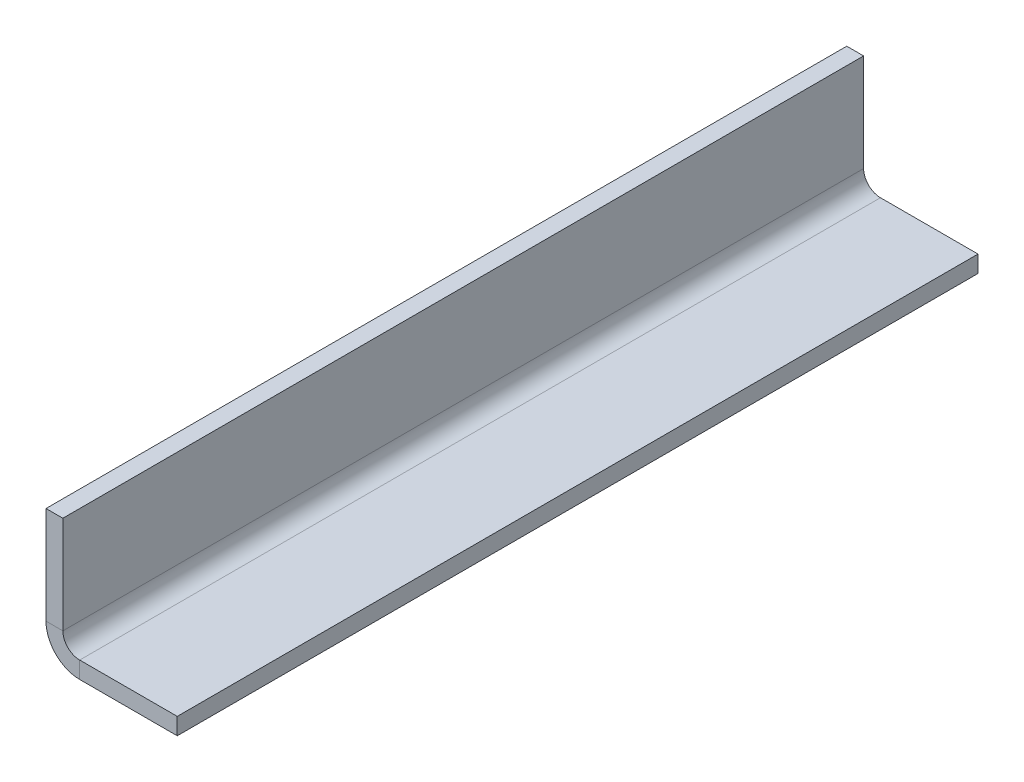
ISO-10303-21;
HEADER;
FILE_DESCRIPTION(('STEP AP214'),'2;1');
FILE_NAME('part.step','',(''),(''),'','','');
FILE_SCHEMA(('AUTOMOTIVE_DESIGN { 1 0 10303 214 1 1 1 1 }'));
ENDSEC;
DATA;
#1=APPLICATION_CONTEXT('core data for automotive mechanical design processes');
#2=APPLICATION_PROTOCOL_DEFINITION('international standard','automotive_design',2000,#1);
#3=PRODUCT_CONTEXT('',#1,'mechanical');
#4=PRODUCT('Part','Part','',(#3));
#5=PRODUCT_RELATED_PRODUCT_CATEGORY('part','',(#4));
#6=PRODUCT_DEFINITION_FORMATION('','',#4);
#7=PRODUCT_DEFINITION_CONTEXT('part definition',#1,'design');
#8=PRODUCT_DEFINITION('design','',#6,#7);
#9=PRODUCT_DEFINITION_SHAPE('','',#8);
#10=(LENGTH_UNIT() NAMED_UNIT(*) SI_UNIT(.MILLI.,.METRE.));
#11=(NAMED_UNIT(*) PLANE_ANGLE_UNIT() SI_UNIT($,.RADIAN.));
#12=(NAMED_UNIT(*) SI_UNIT($,.STERADIAN.) SOLID_ANGLE_UNIT());
#13=UNCERTAINTY_MEASURE_WITH_UNIT(LENGTH_MEASURE(1.E-05),#10,'distance_accuracy_value','');
#14=(GEOMETRIC_REPRESENTATION_CONTEXT(3) GLOBAL_UNCERTAINTY_ASSIGNED_CONTEXT((#13)) GLOBAL_UNIT_ASSIGNED_CONTEXT((#10,
#11,#12)) REPRESENTATION_CONTEXT('',''));
#15=CARTESIAN_POINT('',(0.,0.,0.));
#16=DIRECTION('',(0.,0.,1.));
#17=DIRECTION('',(1.,0.,0.));
#18=AXIS2_PLACEMENT_3D('',#15,#16,#17);
#19=CARTESIAN_POINT('',(-0.7366,-2.5,-17.5));
#20=DIRECTION('',(0.,0.,-1.));
#21=DIRECTION('',(-1.,0.,0.));
#22=AXIS2_PLACEMENT_3D('',#19,#20,#21);
#23=PLANE('',#22);
#24=DIRECTION('',(0.,1.,0.));
#25=VECTOR('',#24,1.);
#26=CARTESIAN_POINT('',(0.,-2.5,-17.5));
#27=LINE('',#26,#25);
#28=CARTESIAN_POINT('',(0.,-1.7634,-17.5));
#29=VERTEX_POINT('',#28);
#30=CARTESIAN_POINT('',(0.,2.5,-17.5));
#31=VERTEX_POINT('',#30);
#32=EDGE_CURVE('E87',#29,#31,#27,.T.);
#33=ORIENTED_EDGE('',*,*,#32,.F.);
#34=DIRECTION('',(-1.,0.,0.));
#35=VECTOR('',#34,1.);
#36=CARTESIAN_POINT('',(0.,-1.7634,-17.5));
#37=LINE('',#36,#35);
#38=CARTESIAN_POINT('',(-0.736599999999998,-1.7634,-17.5));
#39=VERTEX_POINT('',#38);
#40=EDGE_CURVE('E96',#29,#39,#37,.T.);
#41=ORIENTED_EDGE('',*,*,#40,.T.);
#42=DIRECTION('',(0.,1.,0.));
#43=VECTOR('',#42,1.);
#44=CARTESIAN_POINT('',(-0.7366,-2.5,-17.5));
#45=LINE('',#44,#43);
#46=CARTESIAN_POINT('',(-0.7366,2.5,-17.5));
#47=VERTEX_POINT('',#46);
#48=EDGE_CURVE('E83',#39,#47,#45,.T.);
#49=ORIENTED_EDGE('',*,*,#48,.T.);
#50=DIRECTION('',(1.,0.,0.));
#51=VECTOR('',#50,1.);
#52=CARTESIAN_POINT('',(-0.7366,2.5,-17.5));
#53=LINE('',#52,#51);
#54=EDGE_CURVE('E38',#47,#31,#53,.T.);
#55=ORIENTED_EDGE('',*,*,#54,.T.);
#56=EDGE_LOOP('',(#33,#41,#49,#55));
#57=FACE_BOUND('',#56,.T.);
#58=ADVANCED_FACE('F35',(#57),#23,.T.);
#59=CARTESIAN_POINT('',(-0.7366,0.,0.));
#60=DIRECTION('',(-1.,0.,0.));
#61=DIRECTION('',(0.,0.,1.));
#62=AXIS2_PLACEMENT_3D('',#59,#60,#61);
#63=PLANE('',#62);
#64=ORIENTED_EDGE('',*,*,#48,.F.);
#65=DIRECTION('',(0.,0.,-1.));
#66=VECTOR('',#65,1.);
#67=CARTESIAN_POINT('',(-0.736599999999998,-1.7634,-17.5));
#68=LINE('',#67,#66);
#69=CARTESIAN_POINT('',(-0.7366,-1.7634,17.5));
#70=VERTEX_POINT('',#69);
#71=EDGE_CURVE('E113',#39,#70,#68,.F.);
#72=ORIENTED_EDGE('',*,*,#71,.T.);
#73=DIRECTION('',(0.,-1.,0.));
#74=VECTOR('',#73,1.);
#75=CARTESIAN_POINT('',(-0.7366,-2.5,17.5));
#76=LINE('',#75,#74);
#77=CARTESIAN_POINT('',(-0.7366,2.5,17.5));
#78=VERTEX_POINT('',#77);
#79=EDGE_CURVE('E92',#78,#70,#76,.T.);
#80=ORIENTED_EDGE('',*,*,#79,.F.);
#81=DIRECTION('',(0.,0.,1.));
#82=VECTOR('',#81,1.);
#83=CARTESIAN_POINT('',(-0.7366,2.5,17.5));
#84=LINE('',#83,#82);
#85=EDGE_CURVE('E74',#47,#78,#84,.T.);
#86=ORIENTED_EDGE('',*,*,#85,.F.);
#87=EDGE_LOOP('',(#64,#72,#80,#86));
#88=FACE_BOUND('',#87,.T.);
#89=ADVANCED_FACE('F201',(#88),#63,.T.);
#90=CARTESIAN_POINT('',(0.,0.,0.));
#91=DIRECTION('',(-1.,0.,0.));
#92=DIRECTION('',(0.,0.,1.));
#93=AXIS2_PLACEMENT_3D('',#90,#91,#92);
#94=PLANE('',#93);
#95=DIRECTION('',(0.,0.,-1.));
#96=VECTOR('',#95,1.);
#97=CARTESIAN_POINT('',(0.,-1.7634,-17.5));
#98=LINE('',#97,#96);
#99=CARTESIAN_POINT('',(0.,-1.7634,17.5));
#100=VERTEX_POINT('',#99);
#101=EDGE_CURVE('E103',#29,#100,#98,.F.);
#102=ORIENTED_EDGE('',*,*,#101,.F.);
#103=ORIENTED_EDGE('',*,*,#32,.T.);
#104=DIRECTION('',(0.,0.,1.));
#105=VECTOR('',#104,1.);
#106=CARTESIAN_POINT('',(0.,2.5,17.5));
#107=LINE('',#106,#105);
#108=CARTESIAN_POINT('',(0.,2.5,17.5));
#109=VERTEX_POINT('',#108);
#110=EDGE_CURVE('E72',#31,#109,#107,.T.);
#111=ORIENTED_EDGE('',*,*,#110,.T.);
#112=DIRECTION('',(0.,-1.,0.));
#113=VECTOR('',#112,1.);
#114=CARTESIAN_POINT('',(0.,-2.5,17.5));
#115=LINE('',#114,#113);
#116=EDGE_CURVE('E77',#109,#100,#115,.T.);
#117=ORIENTED_EDGE('',*,*,#116,.T.);
#118=EDGE_LOOP('',(#102,#103,#111,#117));
#119=FACE_BOUND('',#118,.T.);
#120=ADVANCED_FACE('F85',(#119),#94,.F.);
#121=CARTESIAN_POINT('',(-0.7366,-2.5,17.5));
#122=DIRECTION('',(0.,0.,1.));
#123=DIRECTION('',(1.,0.,0.));
#124=AXIS2_PLACEMENT_3D('',#121,#122,#123);
#125=PLANE('',#124);
#126=DIRECTION('',(-1.,0.,0.));
#127=VECTOR('',#126,1.);
#128=CARTESIAN_POINT('',(0.,-1.7634,17.5));
#129=LINE('',#128,#127);
#130=EDGE_CURVE('E80',#100,#70,#129,.T.);
#131=ORIENTED_EDGE('',*,*,#130,.F.);
#132=ORIENTED_EDGE('',*,*,#116,.F.);
#133=DIRECTION('',(1.,0.,0.));
#134=VECTOR('',#133,1.);
#135=CARTESIAN_POINT('',(-0.7366,2.5,17.5));
#136=LINE('',#135,#134);
#137=EDGE_CURVE('E11',#78,#109,#136,.T.);
#138=ORIENTED_EDGE('',*,*,#137,.F.);
#139=ORIENTED_EDGE('',*,*,#79,.T.);
#140=EDGE_LOOP('',(#131,#132,#138,#139));
#141=FACE_BOUND('',#140,.T.);
#142=ADVANCED_FACE('F78',(#141),#125,.T.);
#143=CARTESIAN_POINT('',(-0.7366,2.5,17.5));
#144=DIRECTION('',(0.,1.,0.));
#145=DIRECTION('',(0.,0.,1.));
#146=AXIS2_PLACEMENT_3D('',#143,#144,#145);
#147=PLANE('',#146);
#148=ORIENTED_EDGE('',*,*,#110,.F.);
#149=ORIENTED_EDGE('',*,*,#54,.F.);
#150=ORIENTED_EDGE('',*,*,#85,.T.);
#151=ORIENTED_EDGE('',*,*,#137,.T.);
#152=EDGE_LOOP('',(#148,#149,#150,#151));
#153=FACE_BOUND('',#152,.T.);
#154=ADVANCED_FACE('F69',(#153),#147,.T.);
#155=CARTESIAN_POINT('',(0.736599999999999,-1.7634,17.5));
#156=DIRECTION('',(0.,0.,1.));
#157=DIRECTION('',(1.,0.,0.));
#158=AXIS2_PLACEMENT_3D('',#155,#156,#157);
#159=PLANE('',#158);
#160=DIRECTION('',(0.,-1.,0.));
#161=VECTOR('',#160,1.);
#162=CARTESIAN_POINT('',(0.736599999999997,-2.5,17.5));
#163=LINE('',#162,#161);
#164=CARTESIAN_POINT('',(0.736599999999997,-2.5,17.5));
#165=VERTEX_POINT('',#164);
#166=CARTESIAN_POINT('',(0.736599999999994,-3.2366,17.5));
#167=VERTEX_POINT('',#166);
#168=EDGE_CURVE('E143',#165,#167,#163,.T.);
#169=ORIENTED_EDGE('',*,*,#168,.F.);
#170=CARTESIAN_POINT('',(0.736599999999999,-1.7634,17.5));
#171=DIRECTION('',(0.,0.,-1.));
#172=DIRECTION('',(-1.,0.,0.));
#173=AXIS2_PLACEMENT_3D('',#170,#171,#172);
#174=CIRCLE('',#173,0.7366);
#175=EDGE_CURVE('E107',#100,#165,#174,.F.);
#176=ORIENTED_EDGE('',*,*,#175,.F.);
#177=ORIENTED_EDGE('',*,*,#130,.T.);
#178=CARTESIAN_POINT('',(0.736599999999999,-1.7634,17.5));
#179=DIRECTION('',(0.,0.,-1.));
#180=DIRECTION('',(-1.,0.,0.));
#181=AXIS2_PLACEMENT_3D('',#178,#179,#180);
#182=CIRCLE('',#181,1.4732);
#183=EDGE_CURVE('E49',#70,#167,#182,.F.);
#184=ORIENTED_EDGE('',*,*,#183,.T.);
#185=EDGE_LOOP('',(#169,#176,#177,#184));
#186=FACE_BOUND('',#185,.T.);
#187=ADVANCED_FACE('F198',(#186),#159,.T.);
#188=CARTESIAN_POINT('',(0.736600000000002,-1.7634,-17.5));
#189=DIRECTION('',(0.,0.,1.));
#190=DIRECTION('',(1.,0.,0.));
#191=AXIS2_PLACEMENT_3D('',#188,#189,#190);
#192=PLANE('',#191);
#193=CARTESIAN_POINT('',(0.736600000000002,-1.7634,-17.5));
#194=DIRECTION('',(0.,0.,-1.));
#195=DIRECTION('',(-1.,0.,0.));
#196=AXIS2_PLACEMENT_3D('',#193,#194,#195);
#197=CIRCLE('',#196,0.7366);
#198=CARTESIAN_POINT('',(0.736599999999999,-2.5,-17.5));
#199=VERTEX_POINT('',#198);
#200=EDGE_CURVE('E100',#199,#29,#197,.T.);
#201=ORIENTED_EDGE('',*,*,#200,.F.);
#202=DIRECTION('',(0.,-1.,0.));
#203=VECTOR('',#202,1.);
#204=CARTESIAN_POINT('',(0.736599999999999,-2.5,-17.5));
#205=LINE('',#204,#203);
#206=CARTESIAN_POINT('',(0.736599999999996,-3.2366,-17.5));
#207=VERTEX_POINT('',#206);
#208=EDGE_CURVE('E142',#199,#207,#205,.T.);
#209=ORIENTED_EDGE('',*,*,#208,.T.);
#210=CARTESIAN_POINT('',(0.736600000000002,-1.7634,-17.5));
#211=DIRECTION('',(0.,0.,-1.));
#212=DIRECTION('',(-1.,0.,0.));
#213=AXIS2_PLACEMENT_3D('',#210,#211,#212);
#214=CIRCLE('',#213,1.4732);
#215=EDGE_CURVE('E110',#207,#39,#214,.T.);
#216=ORIENTED_EDGE('',*,*,#215,.T.);
#217=ORIENTED_EDGE('',*,*,#40,.F.);
#218=EDGE_LOOP('',(#201,#209,#216,#217));
#219=FACE_BOUND('',#218,.T.);
#220=ADVANCED_FACE('F164',(#219),#192,.F.);
#221=CARTESIAN_POINT('',(0.736600000000002,-1.7634,-17.5));
#222=DIRECTION('',(0.,0.,-1.));
#223=DIRECTION('',(0.,-1.,0.));
#224=AXIS2_PLACEMENT_3D('',#221,#222,#223);
#225=CYLINDRICAL_SURFACE('',#224,1.4732);
#226=ORIENTED_EDGE('',*,*,#71,.F.);
#227=ORIENTED_EDGE('',*,*,#215,.F.);
#228=DIRECTION('',(0.,0.,1.));
#229=VECTOR('',#228,1.);
#230=CARTESIAN_POINT('',(0.736599999999995,-3.2366,0.));
#231=LINE('',#230,#229);
#232=EDGE_CURVE('E133',#207,#167,#231,.T.);
#233=ORIENTED_EDGE('',*,*,#232,.T.);
#234=ORIENTED_EDGE('',*,*,#183,.F.);
#235=EDGE_LOOP('',(#226,#227,#233,#234));
#236=FACE_BOUND('',#235,.T.);
#237=ADVANCED_FACE('F202',(#236),#225,.T.);
#238=CARTESIAN_POINT('',(0.736600000000002,-1.7634,-17.5));
#239=DIRECTION('',(0.,0.,-1.));
#240=DIRECTION('',(0.,-1.,0.));
#241=AXIS2_PLACEMENT_3D('',#238,#239,#240);
#242=CYLINDRICAL_SURFACE('',#241,0.7366);
#243=ORIENTED_EDGE('',*,*,#101,.T.);
#244=ORIENTED_EDGE('',*,*,#175,.T.);
#245=DIRECTION('',(0.,0.,-1.));
#246=VECTOR('',#245,1.);
#247=CARTESIAN_POINT('',(0.736599999999997,-2.5,17.5));
#248=LINE('',#247,#246);
#249=EDGE_CURVE('E146',#165,#199,#248,.T.);
#250=ORIENTED_EDGE('',*,*,#249,.T.);
#251=ORIENTED_EDGE('',*,*,#200,.T.);
#252=EDGE_LOOP('',(#243,#244,#250,#251));
#253=FACE_BOUND('',#252,.T.);
#254=ADVANCED_FACE('F154',(#253),#242,.F.);
#255=CARTESIAN_POINT('',(0.,-3.2366,17.5));
#256=DIRECTION('',(0.,0.,-1.));
#257=DIRECTION('',(-1.,0.,0.));
#258=AXIS2_PLACEMENT_3D('',#255,#256,#257);
#259=PLANE('',#258);
#260=ORIENTED_EDGE('',*,*,#168,.T.);
#261=DIRECTION('',(-1.,0.,0.));
#262=VECTOR('',#261,1.);
#263=CARTESIAN_POINT('',(0.,-3.2366,17.5));
#264=LINE('',#263,#262);
#265=CARTESIAN_POINT('',(5.,-3.23660000000002,17.5));
#266=VERTEX_POINT('',#265);
#267=EDGE_CURVE('E126',#266,#167,#264,.T.);
#268=ORIENTED_EDGE('',*,*,#267,.F.);
#269=DIRECTION('',(0.,1.,0.));
#270=VECTOR('',#269,1.);
#271=CARTESIAN_POINT('',(5.,-3.23660000000002,17.5));
#272=LINE('',#271,#270);
#273=CARTESIAN_POINT('',(5.,-2.50000000000002,17.5));
#274=VERTEX_POINT('',#273);
#275=EDGE_CURVE('E119',#266,#274,#272,.T.);
#276=ORIENTED_EDGE('',*,*,#275,.T.);
#277=DIRECTION('',(-1.,0.,0.));
#278=VECTOR('',#277,1.);
#279=CARTESIAN_POINT('',(0.,-2.5,17.5));
#280=LINE('',#279,#278);
#281=EDGE_CURVE('E130',#274,#165,#280,.T.);
#282=ORIENTED_EDGE('',*,*,#281,.T.);
#283=EDGE_LOOP('',(#260,#268,#276,#282));
#284=FACE_BOUND('',#283,.T.);
#285=ADVANCED_FACE('F185',(#284),#259,.F.);
#286=CARTESIAN_POINT('',(5.,-3.23660000000002,-17.5));
#287=DIRECTION('',(0.,0.,1.));
#288=DIRECTION('',(1.,0.,0.));
#289=AXIS2_PLACEMENT_3D('',#286,#287,#288);
#290=PLANE('',#289);
#291=ORIENTED_EDGE('',*,*,#208,.F.);
#292=DIRECTION('',(1.,0.,0.));
#293=VECTOR('',#292,1.);
#294=CARTESIAN_POINT('',(5.,-2.50000000000002,-17.5));
#295=LINE('',#294,#293);
#296=CARTESIAN_POINT('',(5.,-2.50000000000002,-17.5));
#297=VERTEX_POINT('',#296);
#298=EDGE_CURVE('E127',#199,#297,#295,.T.);
#299=ORIENTED_EDGE('',*,*,#298,.T.);
#300=DIRECTION('',(0.,1.,0.));
#301=VECTOR('',#300,1.);
#302=CARTESIAN_POINT('',(5.,-3.23660000000002,-17.5));
#303=LINE('',#302,#301);
#304=CARTESIAN_POINT('',(5.,-3.23660000000002,-17.5));
#305=VERTEX_POINT('',#304);
#306=EDGE_CURVE('E104',#305,#297,#303,.T.);
#307=ORIENTED_EDGE('',*,*,#306,.F.);
#308=DIRECTION('',(1.,0.,0.));
#309=VECTOR('',#308,1.);
#310=CARTESIAN_POINT('',(5.,-3.23660000000002,-17.5));
#311=LINE('',#310,#309);
#312=EDGE_CURVE('E136',#207,#305,#311,.T.);
#313=ORIENTED_EDGE('',*,*,#312,.F.);
#314=EDGE_LOOP('',(#291,#299,#307,#313));
#315=FACE_BOUND('',#314,.T.);
#316=ADVANCED_FACE('F169',(#315),#290,.F.);
#317=CARTESIAN_POINT('',(0.,-3.2366,0.));
#318=DIRECTION('',(0.,1.,0.));
#319=DIRECTION('',(-1.,0.,0.));
#320=AXIS2_PLACEMENT_3D('',#317,#318,#319);
#321=PLANE('',#320);
#322=ORIENTED_EDGE('',*,*,#232,.F.);
#323=ORIENTED_EDGE('',*,*,#312,.T.);
#324=DIRECTION('',(0.,0.,1.));
#325=VECTOR('',#324,1.);
#326=CARTESIAN_POINT('',(5.,-3.23660000000002,17.5));
#327=LINE('',#326,#325);
#328=EDGE_CURVE('E122',#305,#266,#327,.T.);
#329=ORIENTED_EDGE('',*,*,#328,.T.);
#330=ORIENTED_EDGE('',*,*,#267,.T.);
#331=EDGE_LOOP('',(#322,#323,#329,#330));
#332=FACE_BOUND('',#331,.T.);
#333=ADVANCED_FACE('F190',(#332),#321,.F.);
#334=CARTESIAN_POINT('',(0.,-2.5,0.));
#335=DIRECTION('',(0.,1.,0.));
#336=DIRECTION('',(-1.,0.,0.));
#337=AXIS2_PLACEMENT_3D('',#334,#335,#336);
#338=PLANE('',#337);
#339=ORIENTED_EDGE('',*,*,#298,.F.);
#340=ORIENTED_EDGE('',*,*,#249,.F.);
#341=ORIENTED_EDGE('',*,*,#281,.F.);
#342=DIRECTION('',(0.,0.,1.));
#343=VECTOR('',#342,1.);
#344=CARTESIAN_POINT('',(5.,-2.50000000000002,17.5));
#345=LINE('',#344,#343);
#346=EDGE_CURVE('E123',#297,#274,#345,.T.);
#347=ORIENTED_EDGE('',*,*,#346,.F.);
#348=EDGE_LOOP('',(#339,#340,#341,#347));
#349=FACE_BOUND('',#348,.T.);
#350=ADVANCED_FACE('F173',(#349),#338,.T.);
#351=CARTESIAN_POINT('',(5.,-3.23660000000002,17.5));
#352=DIRECTION('',(-1.,0.,0.));
#353=DIRECTION('',(0.,-1.,0.));
#354=AXIS2_PLACEMENT_3D('',#351,#352,#353);
#355=PLANE('',#354);
#356=ORIENTED_EDGE('',*,*,#346,.T.);
#357=ORIENTED_EDGE('',*,*,#275,.F.);
#358=ORIENTED_EDGE('',*,*,#328,.F.);
#359=ORIENTED_EDGE('',*,*,#306,.T.);
#360=EDGE_LOOP('',(#356,#357,#358,#359));
#361=FACE_BOUND('',#360,.T.);
#362=ADVANCED_FACE('F178',(#361),#355,.F.);
#363=CLOSED_SHELL('',(#58,#89,#120,#142,#154,#187,#220,#237,#254,#285,#316,#333,#350,#362));
#364=MANIFOLD_SOLID_BREP('B2',#363);
#365=ADVANCED_BREP_SHAPE_REPRESENTATION('',(#18,#364),#14);
#366=SHAPE_DEFINITION_REPRESENTATION(#9,#365);
ENDSEC;
END-ISO-10303-21;
